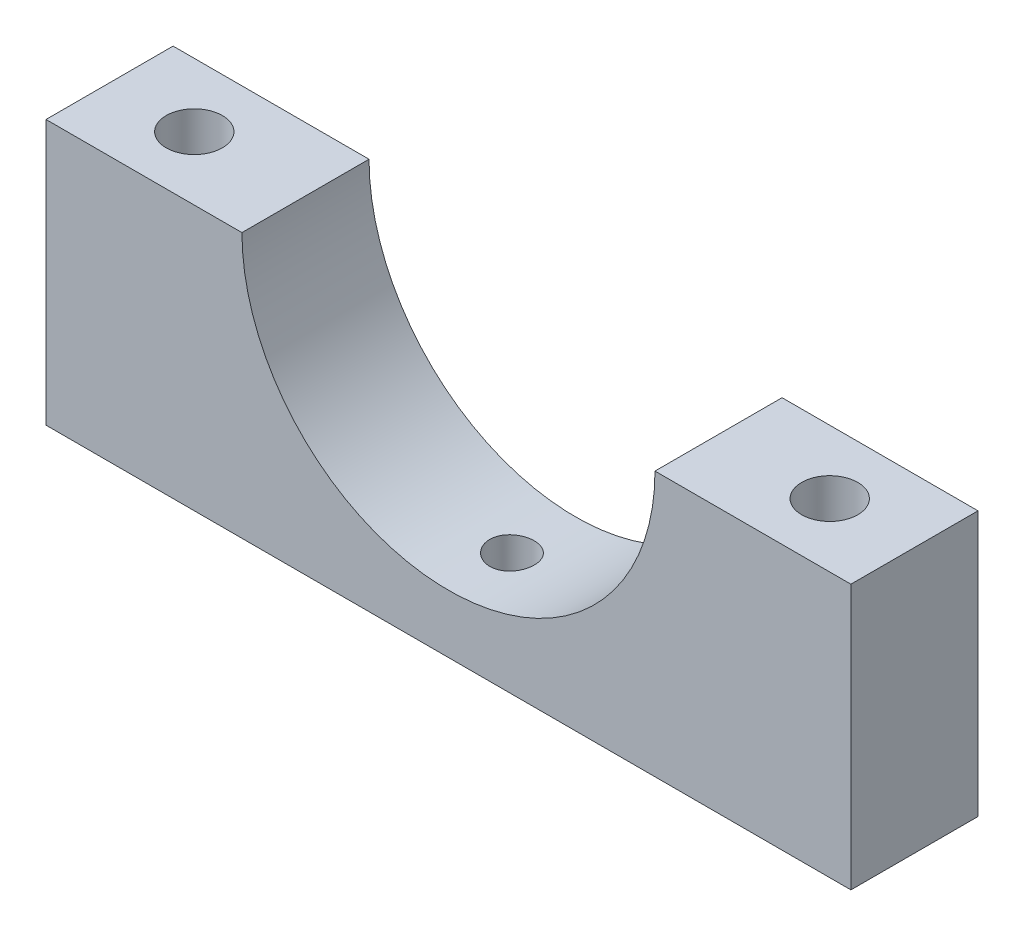
ISO-10303-21;
HEADER;
FILE_DESCRIPTION(('STEP AP214'),'2;1');
FILE_NAME('part.step','',(''),(''),'','','');
FILE_SCHEMA(('AUTOMOTIVE_DESIGN { 1 0 10303 214 1 1 1 1 }'));
ENDSEC;
DATA;
#1=APPLICATION_CONTEXT('core data for automotive mechanical design processes');
#2=APPLICATION_PROTOCOL_DEFINITION('international standard','automotive_design',2000,#1);
#3=PRODUCT_CONTEXT('',#1,'mechanical');
#4=PRODUCT('Part','Part','',(#3));
#5=PRODUCT_RELATED_PRODUCT_CATEGORY('part','',(#4));
#6=PRODUCT_DEFINITION_FORMATION('','',#4);
#7=PRODUCT_DEFINITION_CONTEXT('part definition',#1,'design');
#8=PRODUCT_DEFINITION('design','',#6,#7);
#9=PRODUCT_DEFINITION_SHAPE('','',#8);
#10=(LENGTH_UNIT() NAMED_UNIT(*) SI_UNIT(.MILLI.,.METRE.));
#11=(NAMED_UNIT(*) PLANE_ANGLE_UNIT() SI_UNIT($,.RADIAN.));
#12=(NAMED_UNIT(*) SI_UNIT($,.STERADIAN.) SOLID_ANGLE_UNIT());
#13=UNCERTAINTY_MEASURE_WITH_UNIT(LENGTH_MEASURE(1.E-05),#10,'distance_accuracy_value','');
#14=(GEOMETRIC_REPRESENTATION_CONTEXT(3) GLOBAL_UNCERTAINTY_ASSIGNED_CONTEXT((#13)) GLOBAL_UNIT_ASSIGNED_CONTEXT((#10,
#11,#12)) REPRESENTATION_CONTEXT('',''));
#15=CARTESIAN_POINT('',(0.,0.,0.));
#16=DIRECTION('',(0.,0.,1.));
#17=DIRECTION('',(1.,0.,0.));
#18=AXIS2_PLACEMENT_3D('',#15,#16,#17);
#19=CARTESIAN_POINT('',(-38.,0.,6.));
#20=DIRECTION('',(0.,1.,0.));
#21=DIRECTION('',(0.,0.,1.));
#22=AXIS2_PLACEMENT_3D('',#19,#20,#21);
#23=PLANE('',#22);
#24=CARTESIAN_POINT('',(-30.,0.,0.));
#25=DIRECTION('',(0.,-1.,0.));
#26=DIRECTION('',(0.,0.,-1.));
#27=AXIS2_PLACEMENT_3D('',#24,#25,#26);
#28=CIRCLE('',#27,2.65);
#29=CARTESIAN_POINT('',(-30.,0.,-2.65));
#30=VERTEX_POINT('',#29);
#31=EDGE_CURVE('E244',#30,#30,#28,.T.);
#32=ORIENTED_EDGE('',*,*,#31,.T.);
#33=EDGE_LOOP('',(#32));
#34=FACE_BOUND('',#33,.T.);
#35=DIRECTION('',(0.,0.,1.));
#36=VECTOR('',#35,1.);
#37=CARTESIAN_POINT('',(-19.5,0.,-6.001));
#38=LINE('',#37,#36);
#39=CARTESIAN_POINT('',(-19.5,0.,6.));
#40=VERTEX_POINT('',#39);
#41=CARTESIAN_POINT('',(-19.5,0.,-6.));
#42=VERTEX_POINT('',#41);
#43=EDGE_CURVE('E112',#40,#42,#38,.F.);
#44=ORIENTED_EDGE('',*,*,#43,.T.);
#45=DIRECTION('',(-1.,0.,0.));
#46=VECTOR('',#45,1.);
#47=CARTESIAN_POINT('',(-38.,0.,-6.));
#48=LINE('',#47,#46);
#49=CARTESIAN_POINT('',(-38.,0.,-6.));
#50=VERTEX_POINT('',#49);
#51=EDGE_CURVE('E90',#42,#50,#48,.T.);
#52=ORIENTED_EDGE('',*,*,#51,.T.);
#53=DIRECTION('',(0.,0.,1.));
#54=VECTOR('',#53,1.);
#55=CARTESIAN_POINT('',(-38.,0.,-6.));
#56=LINE('',#55,#54);
#57=CARTESIAN_POINT('',(-38.,0.,6.));
#58=VERTEX_POINT('',#57);
#59=EDGE_CURVE('E119',#50,#58,#56,.T.);
#60=ORIENTED_EDGE('',*,*,#59,.T.);
#61=DIRECTION('',(1.,0.,0.));
#62=VECTOR('',#61,1.);
#63=CARTESIAN_POINT('',(-38.,0.,6.));
#64=LINE('',#63,#62);
#65=EDGE_CURVE('E150',#58,#40,#64,.T.);
#66=ORIENTED_EDGE('',*,*,#65,.T.);
#67=EDGE_LOOP('',(#44,#52,#60,#66));
#68=FACE_BOUND('',#67,.T.);
#69=ADVANCED_FACE('F42',(#34,#68),#23,.T.);
#70=CARTESIAN_POINT('',(-38.,-25.,-6.));
#71=DIRECTION('',(-1.,0.,0.));
#72=DIRECTION('',(0.,0.,1.));
#73=AXIS2_PLACEMENT_3D('',#70,#71,#72);
#74=PLANE('',#73);
#75=ORIENTED_EDGE('',*,*,#59,.F.);
#76=DIRECTION('',(0.,1.,0.));
#77=VECTOR('',#76,1.);
#78=CARTESIAN_POINT('',(-38.,-25.,-6.));
#79=LINE('',#78,#77);
#80=CARTESIAN_POINT('',(-38.,-25.,-6.));
#81=VERTEX_POINT('',#80);
#82=EDGE_CURVE('E11',#81,#50,#79,.T.);
#83=ORIENTED_EDGE('',*,*,#82,.F.);
#84=DIRECTION('',(0.,0.,1.));
#85=VECTOR('',#84,1.);
#86=CARTESIAN_POINT('',(-38.,-25.,-6.));
#87=LINE('',#86,#85);
#88=CARTESIAN_POINT('',(-38.,-25.,6.));
#89=VERTEX_POINT('',#88);
#90=EDGE_CURVE('E125',#81,#89,#87,.T.);
#91=ORIENTED_EDGE('',*,*,#90,.T.);
#92=DIRECTION('',(0.,1.,0.));
#93=VECTOR('',#92,1.);
#94=CARTESIAN_POINT('',(-38.,-25.,6.));
#95=LINE('',#94,#93);
#96=EDGE_CURVE('E46',#89,#58,#95,.T.);
#97=ORIENTED_EDGE('',*,*,#96,.T.);
#98=EDGE_LOOP('',(#75,#83,#91,#97));
#99=FACE_BOUND('',#98,.T.);
#100=ADVANCED_FACE('F44',(#99),#74,.T.);
#101=CARTESIAN_POINT('',(-38.,-25.,-6.));
#102=DIRECTION('',(0.,0.,-1.));
#103=DIRECTION('',(-1.,0.,0.));
#104=AXIS2_PLACEMENT_3D('',#101,#102,#103);
#105=PLANE('',#104);
#106=CARTESIAN_POINT('',(0.,0.,-6.));
#107=DIRECTION('',(0.,0.,-1.));
#108=DIRECTION('',(-1.,0.,0.));
#109=AXIS2_PLACEMENT_3D('',#106,#107,#108);
#110=CIRCLE('',#109,19.5);
#111=CARTESIAN_POINT('',(19.5,0.,-6.));
#112=VERTEX_POINT('',#111);
#113=EDGE_CURVE('E108',#42,#112,#110,.F.);
#114=ORIENTED_EDGE('',*,*,#113,.T.);
#115=CARTESIAN_POINT('',(38.,0.,-6.));
#116=VERTEX_POINT('',#115);
#117=EDGE_CURVE('E118',#116,#112,#48,.T.);
#118=ORIENTED_EDGE('',*,*,#117,.F.);
#119=DIRECTION('',(0.,1.,0.));
#120=VECTOR('',#119,1.);
#121=CARTESIAN_POINT('',(38.,-25.,-6.));
#122=LINE('',#121,#120);
#123=CARTESIAN_POINT('',(38.,-25.,-6.));
#124=VERTEX_POINT('',#123);
#125=EDGE_CURVE('E51',#124,#116,#122,.T.);
#126=ORIENTED_EDGE('',*,*,#125,.F.);
#127=DIRECTION('',(-1.,0.,0.));
#128=VECTOR('',#127,1.);
#129=CARTESIAN_POINT('',(-38.,-25.,-6.));
#130=LINE('',#129,#128);
#131=EDGE_CURVE('E138',#124,#81,#130,.T.);
#132=ORIENTED_EDGE('',*,*,#131,.T.);
#133=ORIENTED_EDGE('',*,*,#82,.T.);
#134=ORIENTED_EDGE('',*,*,#51,.F.);
#135=EDGE_LOOP('',(#114,#118,#126,#132,#133,#134));
#136=FACE_BOUND('',#135,.T.);
#137=ADVANCED_FACE('F117',(#136),#105,.T.);
#138=CARTESIAN_POINT('',(38.,-25.,-6.));
#139=DIRECTION('',(1.,0.,0.));
#140=DIRECTION('',(0.,0.,-1.));
#141=AXIS2_PLACEMENT_3D('',#138,#139,#140);
#142=PLANE('',#141);
#143=DIRECTION('',(0.,0.,-1.));
#144=VECTOR('',#143,1.);
#145=CARTESIAN_POINT('',(38.,0.,-6.));
#146=LINE('',#145,#144);
#147=CARTESIAN_POINT('',(38.,0.,6.));
#148=VERTEX_POINT('',#147);
#149=EDGE_CURVE('E124',#148,#116,#146,.T.);
#150=ORIENTED_EDGE('',*,*,#149,.F.);
#151=DIRECTION('',(0.,1.,0.));
#152=VECTOR('',#151,1.);
#153=CARTESIAN_POINT('',(38.,-25.,6.));
#154=LINE('',#153,#152);
#155=CARTESIAN_POINT('',(38.,-25.,6.));
#156=VERTEX_POINT('',#155);
#157=EDGE_CURVE('E133',#156,#148,#154,.T.);
#158=ORIENTED_EDGE('',*,*,#157,.F.);
#159=DIRECTION('',(0.,0.,-1.));
#160=VECTOR('',#159,1.);
#161=CARTESIAN_POINT('',(38.,-25.,-6.));
#162=LINE('',#161,#160);
#163=EDGE_CURVE('E141',#156,#124,#162,.T.);
#164=ORIENTED_EDGE('',*,*,#163,.T.);
#165=ORIENTED_EDGE('',*,*,#125,.T.);
#166=EDGE_LOOP('',(#150,#158,#164,#165));
#167=FACE_BOUND('',#166,.T.);
#168=ADVANCED_FACE('F165',(#167),#142,.T.);
#169=CARTESIAN_POINT('',(-38.,-25.,6.));
#170=DIRECTION('',(0.,0.,1.));
#171=DIRECTION('',(1.,0.,0.));
#172=AXIS2_PLACEMENT_3D('',#169,#170,#171);
#173=PLANE('',#172);
#174=CARTESIAN_POINT('',(0.,0.,6.));
#175=DIRECTION('',(0.,0.,1.));
#176=DIRECTION('',(1.,0.,0.));
#177=AXIS2_PLACEMENT_3D('',#174,#175,#176);
#178=CIRCLE('',#177,19.5);
#179=CARTESIAN_POINT('',(19.5,0.,6.));
#180=VERTEX_POINT('',#179);
#181=EDGE_CURVE('E59',#40,#180,#178,.T.);
#182=ORIENTED_EDGE('',*,*,#181,.F.);
#183=ORIENTED_EDGE('',*,*,#65,.F.);
#184=ORIENTED_EDGE('',*,*,#96,.F.);
#185=DIRECTION('',(1.,0.,0.));
#186=VECTOR('',#185,1.);
#187=CARTESIAN_POINT('',(-38.,-25.,6.));
#188=LINE('',#187,#186);
#189=EDGE_CURVE('E127',#89,#156,#188,.T.);
#190=ORIENTED_EDGE('',*,*,#189,.T.);
#191=ORIENTED_EDGE('',*,*,#157,.T.);
#192=EDGE_CURVE('E149',#180,#148,#64,.T.);
#193=ORIENTED_EDGE('',*,*,#192,.F.);
#194=EDGE_LOOP('',(#182,#183,#184,#190,#191,#193));
#195=FACE_BOUND('',#194,.T.);
#196=ADVANCED_FACE('F152',(#195),#173,.T.);
#197=CARTESIAN_POINT('',(-38.,-25.,6.));
#198=DIRECTION('',(0.,1.,0.));
#199=DIRECTION('',(0.,0.,1.));
#200=AXIS2_PLACEMENT_3D('',#197,#198,#199);
#201=PLANE('',#200);
#202=CARTESIAN_POINT('',(-30.,-25.,0.));
#203=DIRECTION('',(0.,-1.,0.));
#204=DIRECTION('',(0.,0.,-1.));
#205=AXIS2_PLACEMENT_3D('',#202,#203,#204);
#206=CIRCLE('',#205,5.);
#207=CARTESIAN_POINT('',(-30.,-25.,-5.));
#208=VERTEX_POINT('',#207);
#209=EDGE_CURVE('E237',#208,#208,#206,.T.);
#210=ORIENTED_EDGE('',*,*,#209,.F.);
#211=EDGE_LOOP('',(#210));
#212=FACE_BOUND('',#211,.T.);
#213=CARTESIAN_POINT('',(30.,-25.,0.));
#214=DIRECTION('',(0.,-1.,0.));
#215=DIRECTION('',(0.,0.,-1.));
#216=AXIS2_PLACEMENT_3D('',#213,#214,#215);
#217=CIRCLE('',#216,5.);
#218=CARTESIAN_POINT('',(30.,-25.,-5.));
#219=VERTEX_POINT('',#218);
#220=EDGE_CURVE('E246',#219,#219,#217,.T.);
#221=ORIENTED_EDGE('',*,*,#220,.F.);
#222=EDGE_LOOP('',(#221));
#223=FACE_BOUND('',#222,.T.);
#224=CARTESIAN_POINT('',(0.,-25.,0.));
#225=DIRECTION('',(0.,-1.,0.));
#226=DIRECTION('',(0.,0.,-1.));
#227=AXIS2_PLACEMENT_3D('',#224,#225,#226);
#228=CIRCLE('',#227,2.09999999999999);
#229=CARTESIAN_POINT('',(0.,-25.,-2.09999999999999));
#230=VERTEX_POINT('',#229);
#231=EDGE_CURVE('E187',#230,#230,#228,.T.);
#232=ORIENTED_EDGE('',*,*,#231,.F.);
#233=EDGE_LOOP('',(#232));
#234=FACE_BOUND('',#233,.T.);
#235=ORIENTED_EDGE('',*,*,#90,.F.);
#236=ORIENTED_EDGE('',*,*,#131,.F.);
#237=ORIENTED_EDGE('',*,*,#163,.F.);
#238=ORIENTED_EDGE('',*,*,#189,.F.);
#239=EDGE_LOOP('',(#235,#236,#237,#238));
#240=FACE_BOUND('',#239,.T.);
#241=ADVANCED_FACE('F159',(#212,#223,#234,#240),#201,.F.);
#242=CARTESIAN_POINT('',(30.,0.,0.));
#243=DIRECTION('',(0.,-1.,0.));
#244=DIRECTION('',(0.,0.,-1.));
#245=AXIS2_PLACEMENT_3D('',#242,#243,#244);
#246=CIRCLE('',#245,2.64999999999999);
#247=CARTESIAN_POINT('',(30.,0.,-2.64999999999999));
#248=VERTEX_POINT('',#247);
#249=EDGE_CURVE('E185',#248,#248,#246,.T.);
#250=ORIENTED_EDGE('',*,*,#249,.T.);
#251=EDGE_LOOP('',(#250));
#252=FACE_BOUND('',#251,.T.);
#253=DIRECTION('',(0.,0.,1.));
#254=VECTOR('',#253,1.);
#255=CARTESIAN_POINT('',(19.5,0.,-6.001));
#256=LINE('',#255,#254);
#257=EDGE_CURVE('E105',#112,#180,#256,.T.);
#258=ORIENTED_EDGE('',*,*,#257,.T.);
#259=ORIENTED_EDGE('',*,*,#192,.T.);
#260=ORIENTED_EDGE('',*,*,#149,.T.);
#261=ORIENTED_EDGE('',*,*,#117,.T.);
#262=EDGE_LOOP('',(#258,#259,#260,#261));
#263=FACE_BOUND('',#262,.T.);
#264=ADVANCED_FACE('F122',(#252,#263),#23,.T.);
#265=CARTESIAN_POINT('',(0.,0.,-6.001));
#266=DIRECTION('',(0.,0.,1.));
#267=DIRECTION('',(1.,0.,0.));
#268=AXIS2_PLACEMENT_3D('',#265,#266,#267);
#269=CYLINDRICAL_SURFACE('',#268,19.5);
#270=CARTESIAN_POINT('',(0.,-19.5,-2.09999999999999));
#271=CARTESIAN_POINT('',(0.117592614183072,-19.4999985544558,-2.09999493310377));
#272=CARTESIAN_POINT('',(0.235261765383104,-19.498925022696,-2.090089571923));
#273=CARTESIAN_POINT('',(0.467334384198513,-19.4947457295332,-2.0507266154777));
#274=CARTESIAN_POINT('',(0.581734166592674,-19.4916377624466,-2.02124779866673));
#275=CARTESIAN_POINT('',(0.803874061053285,-19.4837402323996,-1.9436090526376));
#276=CARTESIAN_POINT('',(0.911618278406624,-19.4789517184644,-1.89546077524515));
#277=CARTESIAN_POINT('',(1.11747360243982,-19.4682277189936,-1.78187333229876));
#278=CARTESIAN_POINT('',(1.21558654456646,-19.4622924526388,-1.71643747007431));
#279=CARTESIAN_POINT('',(1.3998232855795,-19.4499116952069,-1.56984182450514));
#280=CARTESIAN_POINT('',(1.48590153248616,-19.4434644030919,-1.4886249394948));
#281=CARTESIAN_POINT('',(1.64323367147123,-19.4308010290827,-1.31289480439821));
#282=CARTESIAN_POINT('',(1.71448685884295,-19.4245849581912,-1.21838092259925));
#283=CARTESIAN_POINT('',(1.84031025820742,-19.4130696769189,-1.01845110900189));
#284=CARTESIAN_POINT('',(1.89483879067584,-19.4077727712135,-0.913008802564407));
#285=CARTESIAN_POINT('',(1.98539887998709,-19.3987183821508,-0.694397685920871));
#286=CARTESIAN_POINT('',(2.02143096265548,-19.3949608550319,-0.581229095464813));
#287=CARTESIAN_POINT('',(2.07383920699992,-19.3894272694583,-0.350845177527719));
#288=CARTESIAN_POINT('',(2.09029137550569,-19.3876435508274,-0.233647327358545));
#289=CARTESIAN_POINT('',(2.10330779585247,-19.3862358787311,0.00185865198576514));
#290=CARTESIAN_POINT('',(2.09987264886761,-19.38661185998,0.120166747491334));
#291=CARTESIAN_POINT('',(2.07327452077228,-19.3894741047594,0.354009317606214));
#292=CARTESIAN_POINT('',(2.05019473573983,-19.3919514686714,0.46955337954139));
#293=CARTESIAN_POINT('',(1.98509203436813,-19.3987234507435,0.695118541220674));
#294=CARTESIAN_POINT('',(1.94306882546812,-19.4030180969693,0.805139555638098));
#295=CARTESIAN_POINT('',(1.84118101601864,-19.4129509504968,1.01679710560464));
#296=CARTESIAN_POINT('',(1.78127972026249,-19.4185919163347,1.11841584207651));
#297=CARTESIAN_POINT('',(1.64536244756703,-19.4305795479873,1.31018940656315));
#298=CARTESIAN_POINT('',(1.56934592331372,-19.4369262377667,1.40034384505491));
#299=CARTESIAN_POINT('',(1.4028923745931,-19.4496498459231,1.5671129543047));
#300=CARTESIAN_POINT('',(1.31238353910797,-19.4560267527704,1.64365596908029));
#301=CARTESIAN_POINT('',(1.11976333647505,-19.4680616961794,1.78047334734346));
#302=CARTESIAN_POINT('',(1.01765195295341,-19.4737197317266,1.8407476878718));
#303=CARTESIAN_POINT('',(0.804673978714089,-19.4836817241394,1.9433147057917));
#304=CARTESIAN_POINT('',(0.693805506216715,-19.4879853889734,1.9856035058016));
#305=CARTESIAN_POINT('',(0.466484981021668,-19.4947508668071,2.05094526577315));
#306=CARTESIAN_POINT('',(0.350033122217682,-19.4972127437172,2.07399889320177));
#307=CARTESIAN_POINT('',(0.115471729119541,-19.5000090240051,2.10012443707711));
#308=CARTESIAN_POINT('',(-0.00262667703777053,-19.5003539498429,2.10329518454496));
#309=CARTESIAN_POINT('',(-0.237673182484063,-19.4989057351505,2.08982489214313));
#310=CARTESIAN_POINT('',(-0.354621299815375,-19.4971126282097,2.07318416351856));
#311=CARTESIAN_POINT('',(-0.583760435772825,-19.4915965034645,2.02064531448551));
#312=CARTESIAN_POINT('',(-0.695962241903675,-19.4878781481507,1.98479371092558));
#313=CARTESIAN_POINT('',(-0.912759691149476,-19.4789284152001,1.89489876943433));
#314=CARTESIAN_POINT('',(-1.01735513809893,-19.4736969985592,1.84085496253428));
#315=CARTESIAN_POINT('',(-1.2164160909609,-19.4622795058917,1.71586632299969));
#316=CARTESIAN_POINT('',(-1.31084079342173,-19.4560898108372,1.64485684148107));
#317=CARTESIAN_POINT('',(-1.48646625530809,-19.4434612570551,1.4880448925621));
#318=CARTESIAN_POINT('',(-1.56766662850074,-19.437022391057,1.40224199325232));
#319=CARTESIAN_POINT('',(-1.71488374867243,-19.4245893003112,1.21784641334293));
#320=CARTESIAN_POINT('',(-1.78083544446756,-19.4185970518475,1.11920164518507));
#321=CARTESIAN_POINT('',(-1.8952352688774,-19.407766467362,0.912178208635531));
#322=CARTESIAN_POINT('',(-1.94368366952682,-19.4029281134068,0.803799691557626));
#323=CARTESIAN_POINT('',(-2.02159374181844,-19.3949658373411,0.580604552046066));
#324=CARTESIAN_POINT('',(-2.05109353977593,-19.3918384744532,0.465801366132677));
#325=CARTESIAN_POINT('',(-2.09039247487902,-19.3876418420358,0.232835585715431));
#326=CARTESIAN_POINT('',(-2.10019227582475,-19.3865725031601,0.114673104540584));
#327=CARTESIAN_POINT('',(-2.09980298598119,-19.3866146215892,-0.121010364871483));
#328=CARTESIAN_POINT('',(-2.08971608019482,-19.3877149304732,-0.23853153716776));
#329=CARTESIAN_POINT('',(-2.05005456822499,-19.3919485415108,-0.470199002941306));
#330=CARTESIAN_POINT('',(-2.02047994504473,-19.3950818454375,-0.584345293474979));
#331=CARTESIAN_POINT('',(-1.94271181343428,-19.4030252100591,-0.806018358867387));
#332=CARTESIAN_POINT('',(-1.89452186517614,-19.4078349501192,-0.913546394908131));
#333=CARTESIAN_POINT('',(-1.78090133831134,-19.4185898697941,-1.11900477917515));
#334=CARTESIAN_POINT('',(-1.7154707664252,-19.4245350489662,-1.21693513114263));
#335=CARTESIAN_POINT('',(-1.5688436042502,-19.436927598445,-1.40094176698244));
#336=CARTESIAN_POINT('',(-1.48757080289952,-19.4433773022533,-1.48695716662827));
#337=CARTESIAN_POINT('',(-1.31172040998774,-19.4560310312647,-1.64417181591933));
#338=CARTESIAN_POINT('',(-1.21713965152323,-19.4622349975378,-1.71536752888594));
#339=CARTESIAN_POINT('',(-1.01705563438742,-19.4737171734856,-1.84108738695461));
#340=CARTESIAN_POINT('',(-0.911521774474536,-19.4789926721069,-1.89556304438292));
#341=CARTESIAN_POINT('',(-0.692812615632226,-19.4879947823793,-1.98594583947915));
#342=CARTESIAN_POINT('',(-0.579646004454492,-19.4917231215729,-2.02187369843256));
#343=CARTESIAN_POINT('',(-0.388211480303308,-19.4962847551397,-2.06528357016872));
#344=CARTESIAN_POINT('',(-0.311162951484537,-19.4976713933684,-2.07828418500869));
#345=CARTESIAN_POINT('',(-0.156087520807935,-19.4995294933155,-2.09564406019908));
#346=CARTESIAN_POINT('',(-0.078060623817133,-19.5000009595848,-2.10000336351974));
#347=CARTESIAN_POINT('',(0.,-19.5,-2.09999999999999));
#348=B_SPLINE_CURVE_WITH_KNOTS('',3,(#270,#271,#272,#273,#274,#275,#276,#277,#278,#279,#280,
#281,#282,#283,#284,#285,#286,#287,#288,#289,#290,#291,#292,#293,#294,#295,#296,#297,#298,#299,
#300,#301,#302,#303,#304,#305,#306,#307,#308,#309,#310,#311,#312,#313,#314,#315,#316,#317,#318,
#319,#320,#321,#322,#323,#324,#325,#326,#327,#328,#329,#330,#331,#332,#333,#334,#335,#336,#337,
#338,#339,#340,#341,#342,#343,#344,#345,#346,#347),.UNSPECIFIED.,.T.,.F.,(4,2,2,2,2,2,2,2,2,2,2,
2,2,2,2,2,2,2,2,2,2,2,2,2,2,2,2,2,2,2,2,2,2,2,2,2,2,2,4),(0.,0.352492771499429,
0.705368341170974,1.05802403069436,1.41061238308271,1.76450112434836,2.11840668381409,
2.47318717669149,2.82795758314736,3.18134627493875,3.53472428419079,3.88661312301853,
4.23850739657643,4.59112896775574,4.94376251677609,5.29820079438154,5.65263957218694,
6.00715472237848,6.36165757026285,6.71439689927731,7.06713068670852,7.41901420543212,
7.77090679589976,8.12416230641124,8.47742813233658,8.83217428076335,9.18691491551858,
9.54093952521516,9.89495220569557,10.2471505831023,10.59934926769,10.9514806277691,
11.3036118505854,11.657480824029,12.0114341507805,12.3664044393317,12.7209772982168,
12.9549710966626,13.1889637315354),.UNSPECIFIED.);
#349=CARTESIAN_POINT('',(0.,-19.5,-2.09999999999999));
#350=VERTEX_POINT('',#349);
#351=EDGE_CURVE('E113',#350,#350,#348,.T.);
#352=ORIENTED_EDGE('',*,*,#351,.T.);
#353=EDGE_LOOP('',(#352));
#354=FACE_BOUND('',#353,.T.);
#355=ORIENTED_EDGE('',*,*,#181,.T.);
#356=ORIENTED_EDGE('',*,*,#257,.F.);
#357=ORIENTED_EDGE('',*,*,#113,.F.);
#358=ORIENTED_EDGE('',*,*,#43,.F.);
#359=EDGE_LOOP('',(#355,#356,#357,#358));
#360=FACE_BOUND('',#359,.T.);
#361=ADVANCED_FACE('F107',(#354,#360),#269,.F.);
#362=CARTESIAN_POINT('',(0.,-25.,0.));
#363=DIRECTION('',(0.,-1.,0.));
#364=DIRECTION('',(0.,0.,-1.));
#365=AXIS2_PLACEMENT_3D('',#362,#363,#364);
#366=CYLINDRICAL_SURFACE('',#365,2.09999999999999);
#367=ORIENTED_EDGE('',*,*,#351,.F.);
#368=EDGE_LOOP('',(#367));
#369=FACE_BOUND('',#368,.T.);
#370=ORIENTED_EDGE('',*,*,#231,.T.);
#371=EDGE_LOOP('',(#370));
#372=FACE_BOUND('',#371,.T.);
#373=ADVANCED_FACE('F179',(#369,#372),#366,.F.);
#374=CARTESIAN_POINT('',(30.,-25.,0.));
#375=DIRECTION('',(0.,-1.,0.));
#376=DIRECTION('',(0.,0.,-1.));
#377=AXIS2_PLACEMENT_3D('',#374,#375,#376);
#378=CYLINDRICAL_SURFACE('',#377,2.65);
#379=ORIENTED_EDGE('',*,*,#249,.F.);
#380=EDGE_LOOP('',(#379));
#381=FACE_BOUND('',#380,.T.);
#382=CARTESIAN_POINT('',(30.,-16.3,0.));
#383=DIRECTION('',(0.,-1.,0.));
#384=DIRECTION('',(0.,0.,-1.));
#385=AXIS2_PLACEMENT_3D('',#382,#383,#384);
#386=CIRCLE('',#385,2.65);
#387=CARTESIAN_POINT('',(30.,-16.3,-2.65));
#388=VERTEX_POINT('',#387);
#389=EDGE_CURVE('E188',#388,#388,#386,.T.);
#390=ORIENTED_EDGE('',*,*,#389,.T.);
#391=EDGE_LOOP('',(#390));
#392=FACE_BOUND('',#391,.T.);
#393=ADVANCED_FACE('F206',(#381,#392),#378,.F.);
#394=CARTESIAN_POINT('',(32.65,-16.3,0.));
#395=DIRECTION('',(0.,1.,0.));
#396=DIRECTION('',(0.,0.,1.));
#397=AXIS2_PLACEMENT_3D('',#394,#395,#396);
#398=PLANE('',#397);
#399=ORIENTED_EDGE('',*,*,#389,.F.);
#400=EDGE_LOOP('',(#399));
#401=FACE_BOUND('',#400,.T.);
#402=CARTESIAN_POINT('',(30.,-16.3,0.));
#403=DIRECTION('',(0.,-1.,0.));
#404=DIRECTION('',(0.,0.,-1.));
#405=AXIS2_PLACEMENT_3D('',#402,#403,#404);
#406=CIRCLE('',#405,5.);
#407=CARTESIAN_POINT('',(30.,-16.3,-5.));
#408=VERTEX_POINT('',#407);
#409=EDGE_CURVE('E193',#408,#408,#406,.T.);
#410=ORIENTED_EDGE('',*,*,#409,.T.);
#411=EDGE_LOOP('',(#410));
#412=FACE_BOUND('',#411,.T.);
#413=ADVANCED_FACE('F210',(#401,#412),#398,.F.);
#414=CARTESIAN_POINT('',(30.,-25.,0.));
#415=DIRECTION('',(0.,-1.,0.));
#416=DIRECTION('',(0.,0.,-1.));
#417=AXIS2_PLACEMENT_3D('',#414,#415,#416);
#418=CYLINDRICAL_SURFACE('',#417,5.);
#419=ORIENTED_EDGE('',*,*,#409,.F.);
#420=EDGE_LOOP('',(#419));
#421=FACE_BOUND('',#420,.T.);
#422=ORIENTED_EDGE('',*,*,#220,.T.);
#423=EDGE_LOOP('',(#422));
#424=FACE_BOUND('',#423,.T.);
#425=ADVANCED_FACE('F213',(#421,#424),#418,.F.);
#426=CARTESIAN_POINT('',(-30.,-25.,0.));
#427=DIRECTION('',(0.,-1.,0.));
#428=DIRECTION('',(0.,0.,-1.));
#429=AXIS2_PLACEMENT_3D('',#426,#427,#428);
#430=CYLINDRICAL_SURFACE('',#429,2.65);
#431=ORIENTED_EDGE('',*,*,#31,.F.);
#432=EDGE_LOOP('',(#431));
#433=FACE_BOUND('',#432,.T.);
#434=CARTESIAN_POINT('',(-30.,-16.3,0.));
#435=DIRECTION('',(0.,-1.,0.));
#436=DIRECTION('',(0.,0.,-1.));
#437=AXIS2_PLACEMENT_3D('',#434,#435,#436);
#438=CIRCLE('',#437,2.65);
#439=CARTESIAN_POINT('',(-30.,-16.3,-2.65));
#440=VERTEX_POINT('',#439);
#441=EDGE_CURVE('E239',#440,#440,#438,.T.);
#442=ORIENTED_EDGE('',*,*,#441,.T.);
#443=EDGE_LOOP('',(#442));
#444=FACE_BOUND('',#443,.T.);
#445=ADVANCED_FACE('F217',(#433,#444),#430,.F.);
#446=CARTESIAN_POINT('',(-27.35,-16.3,0.));
#447=DIRECTION('',(0.,1.,0.));
#448=DIRECTION('',(0.,0.,1.));
#449=AXIS2_PLACEMENT_3D('',#446,#447,#448);
#450=PLANE('',#449);
#451=ORIENTED_EDGE('',*,*,#441,.F.);
#452=EDGE_LOOP('',(#451));
#453=FACE_BOUND('',#452,.T.);
#454=CARTESIAN_POINT('',(-30.,-16.3,0.));
#455=DIRECTION('',(0.,-1.,0.));
#456=DIRECTION('',(0.,0.,-1.));
#457=AXIS2_PLACEMENT_3D('',#454,#455,#456);
#458=CIRCLE('',#457,5.);
#459=CARTESIAN_POINT('',(-30.,-16.3,-5.));
#460=VERTEX_POINT('',#459);
#461=EDGE_CURVE('E234',#460,#460,#458,.T.);
#462=ORIENTED_EDGE('',*,*,#461,.T.);
#463=EDGE_LOOP('',(#462));
#464=FACE_BOUND('',#463,.T.);
#465=ADVANCED_FACE('F221',(#453,#464),#450,.F.);
#466=CARTESIAN_POINT('',(-30.,-25.,0.));
#467=DIRECTION('',(0.,-1.,0.));
#468=DIRECTION('',(0.,0.,-1.));
#469=AXIS2_PLACEMENT_3D('',#466,#467,#468);
#470=CYLINDRICAL_SURFACE('',#469,5.);
#471=ORIENTED_EDGE('',*,*,#461,.F.);
#472=EDGE_LOOP('',(#471));
#473=FACE_BOUND('',#472,.T.);
#474=ORIENTED_EDGE('',*,*,#209,.T.);
#475=EDGE_LOOP('',(#474));
#476=FACE_BOUND('',#475,.T.);
#477=ADVANCED_FACE('F225',(#473,#476),#470,.F.);
#478=CLOSED_SHELL('',(#69,#100,#137,#168,#196,#241,#264,#361,#373,#393,#413,#425,#445,#465,#477));
#479=MANIFOLD_SOLID_BREP('B2',#478);
#480=ADVANCED_BREP_SHAPE_REPRESENTATION('',(#18,#479),#14);
#481=SHAPE_DEFINITION_REPRESENTATION(#9,#480);
ENDSEC;
END-ISO-10303-21;
